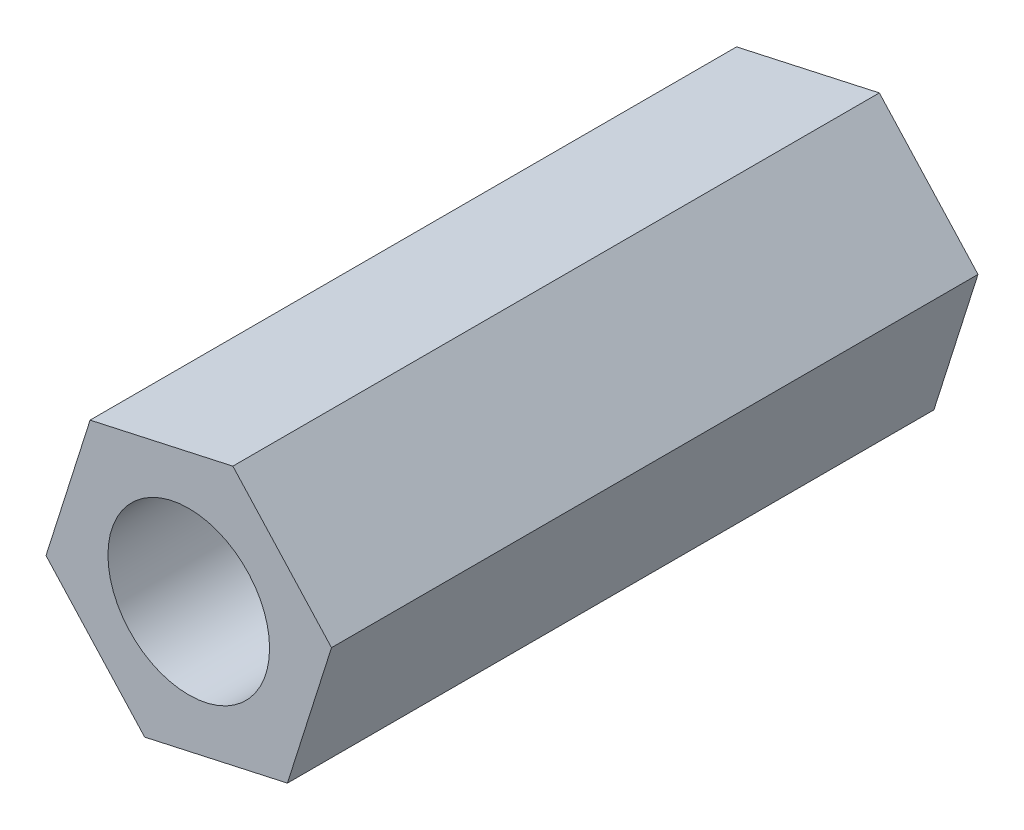
ISO-10303-21;
HEADER;
FILE_DESCRIPTION(('STEP AP214'),'2;1');
FILE_NAME('part.step','',(''),(''),'','','');
FILE_SCHEMA(('AUTOMOTIVE_DESIGN { 1 0 10303 214 1 1 1 1 }'));
ENDSEC;
DATA;
#1=APPLICATION_CONTEXT('core data for automotive mechanical design processes');
#2=APPLICATION_PROTOCOL_DEFINITION('international standard','automotive_design',2000,#1);
#3=PRODUCT_CONTEXT('',#1,'mechanical');
#4=PRODUCT('Part','Part','',(#3));
#5=PRODUCT_RELATED_PRODUCT_CATEGORY('part','',(#4));
#6=PRODUCT_DEFINITION_FORMATION('','',#4);
#7=PRODUCT_DEFINITION_CONTEXT('part definition',#1,'design');
#8=PRODUCT_DEFINITION('design','',#6,#7);
#9=PRODUCT_DEFINITION_SHAPE('','',#8);
#10=(LENGTH_UNIT() NAMED_UNIT(*) SI_UNIT(.MILLI.,.METRE.));
#11=(NAMED_UNIT(*) PLANE_ANGLE_UNIT() SI_UNIT($,.RADIAN.));
#12=(NAMED_UNIT(*) SI_UNIT($,.STERADIAN.) SOLID_ANGLE_UNIT());
#13=UNCERTAINTY_MEASURE_WITH_UNIT(LENGTH_MEASURE(1.E-05),#10,'distance_accuracy_value','');
#14=(GEOMETRIC_REPRESENTATION_CONTEXT(3) GLOBAL_UNCERTAINTY_ASSIGNED_CONTEXT((#13)) GLOBAL_UNIT_ASSIGNED_CONTEXT((#10,
#11,#12)) REPRESENTATION_CONTEXT('',''));
#15=CARTESIAN_POINT('',(0.,0.,0.));
#16=DIRECTION('',(0.,0.,1.));
#17=DIRECTION('',(1.,0.,0.));
#18=AXIS2_PLACEMENT_3D('',#15,#16,#17);
#19=CARTESIAN_POINT('',(0.,0.,12.));
#20=DIRECTION('',(0.,0.,1.));
#21=DIRECTION('',(1.,0.,0.));
#22=AXIS2_PLACEMENT_3D('',#19,#20,#21);
#23=PLANE('',#22);
#24=DIRECTION('',(0.301648882780597,0.953419084934436,0.));
#25=VECTOR('',#24,1.);
#26=CARTESIAN_POINT('',(1.83126574996171,-2.00244827307736,12.));
#27=LINE('',#26,#25);
#28=CARTESIAN_POINT('',(1.83126574996171,-2.00244827307736,12.));
#29=VERTEX_POINT('',#28);
#30=CARTESIAN_POINT('',(2.64980394923012,0.584698524008543,12.));
#31=VERTEX_POINT('',#30);
#32=EDGE_CURVE('E129',#29,#31,#27,.T.);
#33=ORIENTED_EDGE('',*,*,#32,.T.);
#34=DIRECTION('',(-0.674860706615837,0.737945137978409,0.));
#35=VECTOR('',#34,1.);
#36=CARTESIAN_POINT('',(2.64980394923012,0.584698524008543,12.));
#37=LINE('',#36,#35);
#38=CARTESIAN_POINT('',(0.818538199268401,2.58714679708588,12.));
#39=VERTEX_POINT('',#38);
#40=EDGE_CURVE('E87',#31,#39,#37,.T.);
#41=ORIENTED_EDGE('',*,*,#40,.T.);
#42=DIRECTION('',(-0.976509589396434,-0.215473946956026,0.));
#43=VECTOR('',#42,1.);
#44=CARTESIAN_POINT('',(0.818538199268401,2.58714679708588,12.));
#45=LINE('',#44,#43);
#46=CARTESIAN_POINT('',(-1.8312657499617,2.00244827307734,12.));
#47=VERTEX_POINT('',#46);
#48=EDGE_CURVE('E100',#39,#47,#45,.T.);
#49=ORIENTED_EDGE('',*,*,#48,.T.);
#50=DIRECTION('',(-0.301648882780597,-0.953419084934436,0.));
#51=VECTOR('',#50,1.);
#52=CARTESIAN_POINT('',(-1.8312657499617,2.00244827307734,12.));
#53=LINE('',#52,#51);
#54=CARTESIAN_POINT('',(-2.6498039492301,-0.584698524008529,12.));
#55=VERTEX_POINT('',#54);
#56=EDGE_CURVE('E94',#47,#55,#53,.T.);
#57=ORIENTED_EDGE('',*,*,#56,.T.);
#58=DIRECTION('',(0.674860706615837,-0.737945137978409,0.));
#59=VECTOR('',#58,1.);
#60=CARTESIAN_POINT('',(-2.6498039492301,-0.584698524008529,12.));
#61=LINE('',#60,#59);
#62=CARTESIAN_POINT('',(-0.818538199268357,-2.58714679708589,12.));
#63=VERTEX_POINT('',#62);
#64=EDGE_CURVE('E98',#55,#63,#61,.T.);
#65=ORIENTED_EDGE('',*,*,#64,.T.);
#66=DIRECTION('',(0.976509589396434,0.215473946956027,0.));
#67=VECTOR('',#66,1.);
#68=CARTESIAN_POINT('',(-0.818538199268357,-2.58714679708589,12.));
#69=LINE('',#68,#67);
#70=EDGE_CURVE('E50',#63,#29,#69,.T.);
#71=ORIENTED_EDGE('',*,*,#70,.T.);
#72=EDGE_LOOP('',(#33,#41,#49,#57,#65,#71));
#73=FACE_BOUND('',#72,.T.);
#74=CARTESIAN_POINT('',(0.,0.,12.));
#75=DIRECTION('',(0.,0.,1.));
#76=DIRECTION('',(1.,0.,0.));
#77=AXIS2_PLACEMENT_3D('',#74,#75,#76);
#78=CIRCLE('',#77,1.5);
#79=CARTESIAN_POINT('',(1.5,0.,12.));
#80=VERTEX_POINT('',#79);
#81=EDGE_CURVE('E122',#80,#80,#78,.T.);
#82=ORIENTED_EDGE('',*,*,#81,.F.);
#83=EDGE_LOOP('',(#82));
#84=FACE_BOUND('',#83,.T.);
#85=ADVANCED_FACE('F33',(#73,#84),#23,.T.);
#86=CARTESIAN_POINT('',(0.,0.,0.));
#87=DIRECTION('',(0.,0.,1.));
#88=DIRECTION('',(1.,0.,0.));
#89=AXIS2_PLACEMENT_3D('',#86,#87,#88);
#90=PLANE('',#89);
#91=DIRECTION('',(0.301648882780597,0.953419084934436,0.));
#92=VECTOR('',#91,1.);
#93=CARTESIAN_POINT('',(1.83126574996171,-2.00244827307736,0.));
#94=LINE('',#93,#92);
#95=CARTESIAN_POINT('',(1.83126574996171,-2.00244827307736,0.));
#96=VERTEX_POINT('',#95);
#97=CARTESIAN_POINT('',(2.64980394923012,0.584698524008543,0.));
#98=VERTEX_POINT('',#97);
#99=EDGE_CURVE('E118',#96,#98,#94,.T.);
#100=ORIENTED_EDGE('',*,*,#99,.F.);
#101=DIRECTION('',(0.976509589396434,0.215473946956027,0.));
#102=VECTOR('',#101,1.);
#103=CARTESIAN_POINT('',(-0.818538199268357,-2.58714679708589,0.));
#104=LINE('',#103,#102);
#105=CARTESIAN_POINT('',(-0.818538199268357,-2.58714679708589,0.));
#106=VERTEX_POINT('',#105);
#107=EDGE_CURVE('E79',#106,#96,#104,.T.);
#108=ORIENTED_EDGE('',*,*,#107,.F.);
#109=DIRECTION('',(0.674860706615837,-0.737945137978409,0.));
#110=VECTOR('',#109,1.);
#111=CARTESIAN_POINT('',(-2.6498039492301,-0.584698524008529,0.));
#112=LINE('',#111,#110);
#113=CARTESIAN_POINT('',(-2.6498039492301,-0.584698524008529,0.));
#114=VERTEX_POINT('',#113);
#115=EDGE_CURVE('E73',#114,#106,#112,.T.);
#116=ORIENTED_EDGE('',*,*,#115,.F.);
#117=DIRECTION('',(-0.301648882780597,-0.953419084934436,0.));
#118=VECTOR('',#117,1.);
#119=CARTESIAN_POINT('',(-1.8312657499617,2.00244827307734,0.));
#120=LINE('',#119,#118);
#121=CARTESIAN_POINT('',(-1.8312657499617,2.00244827307734,0.));
#122=VERTEX_POINT('',#121);
#123=EDGE_CURVE('E108',#122,#114,#120,.T.);
#124=ORIENTED_EDGE('',*,*,#123,.F.);
#125=DIRECTION('',(-0.976509589396434,-0.215473946956026,0.));
#126=VECTOR('',#125,1.);
#127=CARTESIAN_POINT('',(0.818538199268401,2.58714679708588,0.));
#128=LINE('',#127,#126);
#129=CARTESIAN_POINT('',(0.818538199268401,2.58714679708588,0.));
#130=VERTEX_POINT('',#129);
#131=EDGE_CURVE('E124',#130,#122,#128,.T.);
#132=ORIENTED_EDGE('',*,*,#131,.F.);
#133=DIRECTION('',(-0.674860706615837,0.737945137978409,0.));
#134=VECTOR('',#133,1.);
#135=CARTESIAN_POINT('',(2.64980394923012,0.584698524008543,0.));
#136=LINE('',#135,#134);
#137=EDGE_CURVE('E121',#98,#130,#136,.T.);
#138=ORIENTED_EDGE('',*,*,#137,.F.);
#139=EDGE_LOOP('',(#100,#108,#116,#124,#132,#138));
#140=FACE_BOUND('',#139,.T.);
#141=CARTESIAN_POINT('',(0.,0.,0.));
#142=DIRECTION('',(0.,0.,1.));
#143=DIRECTION('',(1.,0.,0.));
#144=AXIS2_PLACEMENT_3D('',#141,#142,#143);
#145=CIRCLE('',#144,1.5);
#146=CARTESIAN_POINT('',(1.5,0.,0.));
#147=VERTEX_POINT('',#146);
#148=EDGE_CURVE('E222',#147,#147,#145,.T.);
#149=ORIENTED_EDGE('',*,*,#148,.T.);
#150=EDGE_LOOP('',(#149));
#151=FACE_BOUND('',#150,.T.);
#152=ADVANCED_FACE('F138',(#140,#151),#90,.F.);
#153=CARTESIAN_POINT('',(1.83126574996171,-2.00244827307736,12.));
#154=DIRECTION('',(-0.953419084934436,0.301648882780597,0.));
#155=DIRECTION('',(-0.301648882780597,-0.953419084934436,0.));
#156=AXIS2_PLACEMENT_3D('',#153,#154,#155);
#157=PLANE('',#156);
#158=ORIENTED_EDGE('',*,*,#99,.T.);
#159=DIRECTION('',(0.,0.,-1.));
#160=VECTOR('',#159,1.);
#161=CARTESIAN_POINT('',(2.64980394923012,0.584698524008543,12.));
#162=LINE('',#161,#160);
#163=EDGE_CURVE('E11',#31,#98,#162,.T.);
#164=ORIENTED_EDGE('',*,*,#163,.F.);
#165=ORIENTED_EDGE('',*,*,#32,.F.);
#166=DIRECTION('',(0.,0.,-1.));
#167=VECTOR('',#166,1.);
#168=CARTESIAN_POINT('',(1.83126574996171,-2.00244827307736,12.));
#169=LINE('',#168,#167);
#170=EDGE_CURVE('E114',#29,#96,#169,.T.);
#171=ORIENTED_EDGE('',*,*,#170,.T.);
#172=EDGE_LOOP('',(#158,#164,#165,#171));
#173=FACE_BOUND('',#172,.T.);
#174=ADVANCED_FACE('F35',(#173),#157,.F.);
#175=CARTESIAN_POINT('',(2.64980394923012,0.584698524008543,12.));
#176=DIRECTION('',(-0.737945137978409,-0.674860706615837,0.));
#177=DIRECTION('',(0.674860706615837,-0.737945137978409,0.));
#178=AXIS2_PLACEMENT_3D('',#175,#176,#177);
#179=PLANE('',#178);
#180=ORIENTED_EDGE('',*,*,#137,.T.);
#181=DIRECTION('',(0.,0.,-1.));
#182=VECTOR('',#181,1.);
#183=CARTESIAN_POINT('',(0.818538199268401,2.58714679708588,12.));
#184=LINE('',#183,#182);
#185=EDGE_CURVE('E42',#39,#130,#184,.T.);
#186=ORIENTED_EDGE('',*,*,#185,.F.);
#187=ORIENTED_EDGE('',*,*,#40,.F.);
#188=ORIENTED_EDGE('',*,*,#163,.T.);
#189=EDGE_LOOP('',(#180,#186,#187,#188));
#190=FACE_BOUND('',#189,.T.);
#191=ADVANCED_FACE('F163',(#190),#179,.F.);
#192=CARTESIAN_POINT('',(0.818538199268401,2.58714679708588,12.));
#193=DIRECTION('',(0.215473946956026,-0.976509589396434,0.));
#194=DIRECTION('',(0.976509589396434,0.215473946956026,0.));
#195=AXIS2_PLACEMENT_3D('',#192,#193,#194);
#196=PLANE('',#195);
#197=ORIENTED_EDGE('',*,*,#131,.T.);
#198=DIRECTION('',(0.,0.,-1.));
#199=VECTOR('',#198,1.);
#200=CARTESIAN_POINT('',(-1.8312657499617,2.00244827307734,12.));
#201=LINE('',#200,#199);
#202=EDGE_CURVE('E109',#47,#122,#201,.T.);
#203=ORIENTED_EDGE('',*,*,#202,.F.);
#204=ORIENTED_EDGE('',*,*,#48,.F.);
#205=ORIENTED_EDGE('',*,*,#185,.T.);
#206=EDGE_LOOP('',(#197,#203,#204,#205));
#207=FACE_BOUND('',#206,.T.);
#208=ADVANCED_FACE('F135',(#207),#196,.F.);
#209=CARTESIAN_POINT('',(-1.8312657499617,2.00244827307734,12.));
#210=DIRECTION('',(0.953419084934436,-0.301648882780597,0.));
#211=DIRECTION('',(0.301648882780597,0.953419084934436,0.));
#212=AXIS2_PLACEMENT_3D('',#209,#210,#211);
#213=PLANE('',#212);
#214=ORIENTED_EDGE('',*,*,#123,.T.);
#215=DIRECTION('',(0.,0.,-1.));
#216=VECTOR('',#215,1.);
#217=CARTESIAN_POINT('',(-2.6498039492301,-0.584698524008529,12.));
#218=LINE('',#217,#216);
#219=EDGE_CURVE('E105',#55,#114,#218,.T.);
#220=ORIENTED_EDGE('',*,*,#219,.F.);
#221=ORIENTED_EDGE('',*,*,#56,.F.);
#222=ORIENTED_EDGE('',*,*,#202,.T.);
#223=EDGE_LOOP('',(#214,#220,#221,#222));
#224=FACE_BOUND('',#223,.T.);
#225=ADVANCED_FACE('F106',(#224),#213,.F.);
#226=CARTESIAN_POINT('',(-2.6498039492301,-0.584698524008529,12.));
#227=DIRECTION('',(0.737945137978409,0.674860706615837,0.));
#228=DIRECTION('',(-0.674860706615837,0.737945137978409,0.));
#229=AXIS2_PLACEMENT_3D('',#226,#227,#228);
#230=PLANE('',#229);
#231=ORIENTED_EDGE('',*,*,#115,.T.);
#232=DIRECTION('',(0.,0.,-1.));
#233=VECTOR('',#232,1.);
#234=CARTESIAN_POINT('',(-0.818538199268357,-2.58714679708589,12.));
#235=LINE('',#234,#233);
#236=EDGE_CURVE('E110',#63,#106,#235,.T.);
#237=ORIENTED_EDGE('',*,*,#236,.F.);
#238=ORIENTED_EDGE('',*,*,#64,.F.);
#239=ORIENTED_EDGE('',*,*,#219,.T.);
#240=EDGE_LOOP('',(#231,#237,#238,#239));
#241=FACE_BOUND('',#240,.T.);
#242=ADVANCED_FACE('F112',(#241),#230,.F.);
#243=CARTESIAN_POINT('',(-0.818538199268357,-2.58714679708589,12.));
#244=DIRECTION('',(-0.215473946956027,0.976509589396434,0.));
#245=DIRECTION('',(-0.976509589396434,-0.215473946956027,0.));
#246=AXIS2_PLACEMENT_3D('',#243,#244,#245);
#247=PLANE('',#246);
#248=ORIENTED_EDGE('',*,*,#107,.T.);
#249=ORIENTED_EDGE('',*,*,#170,.F.);
#250=ORIENTED_EDGE('',*,*,#70,.F.);
#251=ORIENTED_EDGE('',*,*,#236,.T.);
#252=EDGE_LOOP('',(#248,#249,#250,#251));
#253=FACE_BOUND('',#252,.T.);
#254=ADVANCED_FACE('F143',(#253),#247,.F.);
#255=CARTESIAN_POINT('',(0.,0.,12.));
#256=DIRECTION('',(0.,0.,-1.));
#257=DIRECTION('',(-1.,0.,0.));
#258=AXIS2_PLACEMENT_3D('',#255,#256,#257);
#259=CYLINDRICAL_SURFACE('',#258,1.5);
#260=ORIENTED_EDGE('',*,*,#81,.T.);
#261=EDGE_LOOP('',(#260));
#262=FACE_BOUND('',#261,.T.);
#263=ORIENTED_EDGE('',*,*,#148,.F.);
#264=EDGE_LOOP('',(#263));
#265=FACE_BOUND('',#264,.T.);
#266=ADVANCED_FACE('F145',(#262,#265),#259,.F.);
#267=CLOSED_SHELL('',(#85,#152,#174,#191,#208,#225,#242,#254,#266));
#268=MANIFOLD_SOLID_BREP('B2',#267);
#269=ADVANCED_BREP_SHAPE_REPRESENTATION('',(#18,#268),#14);
#270=SHAPE_DEFINITION_REPRESENTATION(#9,#269);
ENDSEC;
END-ISO-10303-21;
